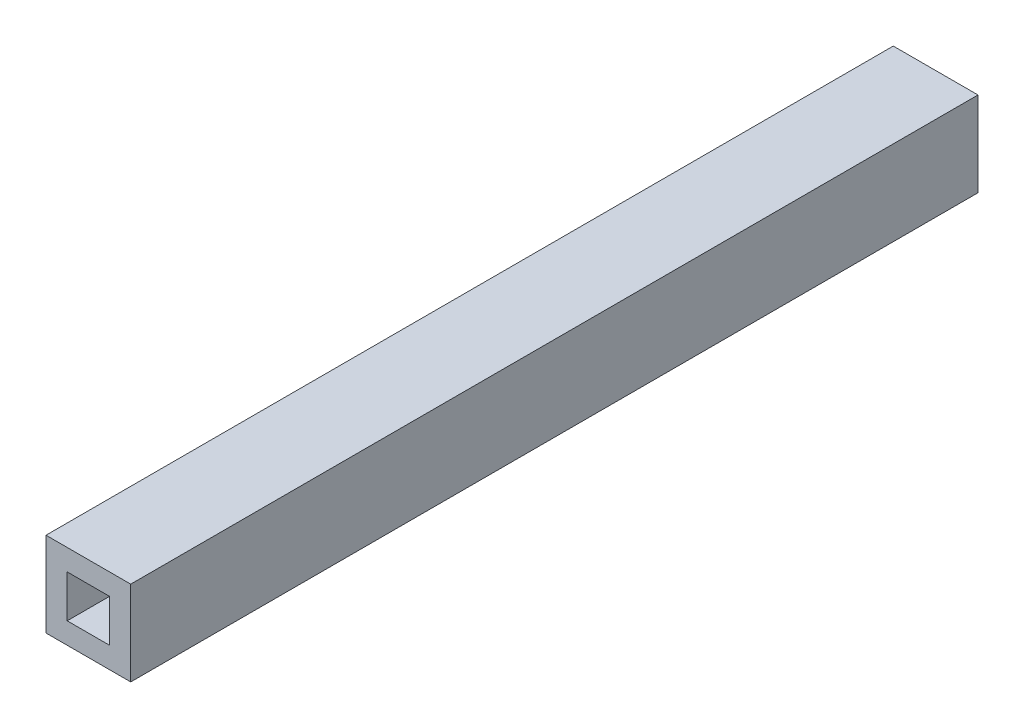
ISO-10303-21;
HEADER;
FILE_DESCRIPTION(('STEP AP214'),'2;1');
FILE_NAME('part.step','',(''),(''),'','','');
FILE_SCHEMA(('AUTOMOTIVE_DESIGN { 1 0 10303 214 1 1 1 1 }'));
ENDSEC;
DATA;
#1=APPLICATION_CONTEXT('core data for automotive mechanical design processes');
#2=APPLICATION_PROTOCOL_DEFINITION('international standard','automotive_design',2000,#1);
#3=PRODUCT_CONTEXT('',#1,'mechanical');
#4=PRODUCT('Part','Part','',(#3));
#5=PRODUCT_RELATED_PRODUCT_CATEGORY('part','',(#4));
#6=PRODUCT_DEFINITION_FORMATION('','',#4);
#7=PRODUCT_DEFINITION_CONTEXT('part definition',#1,'design');
#8=PRODUCT_DEFINITION('design','',#6,#7);
#9=PRODUCT_DEFINITION_SHAPE('','',#8);
#10=(LENGTH_UNIT() NAMED_UNIT(*) SI_UNIT(.MILLI.,.METRE.));
#11=(NAMED_UNIT(*) PLANE_ANGLE_UNIT() SI_UNIT($,.RADIAN.));
#12=(NAMED_UNIT(*) SI_UNIT($,.STERADIAN.) SOLID_ANGLE_UNIT());
#13=UNCERTAINTY_MEASURE_WITH_UNIT(LENGTH_MEASURE(1.E-05),#10,'distance_accuracy_value','');
#14=(GEOMETRIC_REPRESENTATION_CONTEXT(3) GLOBAL_UNCERTAINTY_ASSIGNED_CONTEXT((#13)) GLOBAL_UNIT_ASSIGNED_CONTEXT((#10,
#11,#12)) REPRESENTATION_CONTEXT('',''));
#15=CARTESIAN_POINT('',(0.,0.,0.));
#16=DIRECTION('',(0.,0.,1.));
#17=DIRECTION('',(1.,0.,0.));
#18=AXIS2_PLACEMENT_3D('',#15,#16,#17);
#19=CARTESIAN_POINT('',(0.,0.,200.));
#20=DIRECTION('',(0.,0.,1.));
#21=DIRECTION('',(1.,0.,0.));
#22=AXIS2_PLACEMENT_3D('',#19,#20,#21);
#23=PLANE('',#22);
#24=DIRECTION('',(0.,1.,0.));
#25=VECTOR('',#24,1.);
#26=CARTESIAN_POINT('',(10.,-10.,200.));
#27=LINE('',#26,#25);
#28=CARTESIAN_POINT('',(10.,-10.,200.));
#29=VERTEX_POINT('',#28);
#30=CARTESIAN_POINT('',(10.,10.,200.));
#31=VERTEX_POINT('',#30);
#32=EDGE_CURVE('E158',#29,#31,#27,.T.);
#33=ORIENTED_EDGE('',*,*,#32,.T.);
#34=DIRECTION('',(-1.,0.,0.));
#35=VECTOR('',#34,1.);
#36=CARTESIAN_POINT('',(-10.,10.,200.));
#37=LINE('',#36,#35);
#38=CARTESIAN_POINT('',(-10.,10.,200.));
#39=VERTEX_POINT('',#38);
#40=EDGE_CURVE('E161',#31,#39,#37,.T.);
#41=ORIENTED_EDGE('',*,*,#40,.T.);
#42=DIRECTION('',(0.,-1.,0.));
#43=VECTOR('',#42,1.);
#44=CARTESIAN_POINT('',(-10.,-10.,200.));
#45=LINE('',#44,#43);
#46=CARTESIAN_POINT('',(-10.,-10.,200.));
#47=VERTEX_POINT('',#46);
#48=EDGE_CURVE('E164',#39,#47,#45,.T.);
#49=ORIENTED_EDGE('',*,*,#48,.T.);
#50=DIRECTION('',(1.,0.,0.));
#51=VECTOR('',#50,1.);
#52=CARTESIAN_POINT('',(-10.,-10.,200.));
#53=LINE('',#52,#51);
#54=EDGE_CURVE('E166',#47,#29,#53,.T.);
#55=ORIENTED_EDGE('',*,*,#54,.T.);
#56=EDGE_LOOP('',(#33,#41,#49,#55));
#57=FACE_BOUND('',#56,.T.);
#58=DIRECTION('',(-1.,0.,0.));
#59=VECTOR('',#58,1.);
#60=CARTESIAN_POINT('',(0.,5.,200.));
#61=LINE('',#60,#59);
#62=CARTESIAN_POINT('',(5.,5.,200.));
#63=VERTEX_POINT('',#62);
#64=CARTESIAN_POINT('',(-5.,5.,200.));
#65=VERTEX_POINT('',#64);
#66=EDGE_CURVE('E130',#63,#65,#61,.T.);
#67=ORIENTED_EDGE('',*,*,#66,.F.);
#68=DIRECTION('',(0.,1.,0.));
#69=VECTOR('',#68,1.);
#70=CARTESIAN_POINT('',(5.,0.,200.));
#71=LINE('',#70,#69);
#72=CARTESIAN_POINT('',(5.,-5.,200.));
#73=VERTEX_POINT('',#72);
#74=EDGE_CURVE('E122',#73,#63,#71,.T.);
#75=ORIENTED_EDGE('',*,*,#74,.F.);
#76=DIRECTION('',(1.,0.,0.));
#77=VECTOR('',#76,1.);
#78=CARTESIAN_POINT('',(0.,-5.,200.));
#79=LINE('',#78,#77);
#80=CARTESIAN_POINT('',(-5.,-5.,200.));
#81=VERTEX_POINT('',#80);
#82=EDGE_CURVE('E144',#81,#73,#79,.T.);
#83=ORIENTED_EDGE('',*,*,#82,.F.);
#84=DIRECTION('',(0.,-1.,0.));
#85=VECTOR('',#84,1.);
#86=CARTESIAN_POINT('',(-5.,0.,200.));
#87=LINE('',#86,#85);
#88=EDGE_CURVE('E142',#65,#81,#87,.T.);
#89=ORIENTED_EDGE('',*,*,#88,.F.);
#90=EDGE_LOOP('',(#67,#75,#83,#89));
#91=FACE_BOUND('',#90,.T.);
#92=ADVANCED_FACE('F57',(#57,#91),#23,.T.);
#93=CARTESIAN_POINT('',(0.,0.,0.));
#94=DIRECTION('',(0.,0.,1.));
#95=DIRECTION('',(1.,0.,0.));
#96=AXIS2_PLACEMENT_3D('',#93,#94,#95);
#97=PLANE('',#96);
#98=DIRECTION('',(0.,1.,0.));
#99=VECTOR('',#98,1.);
#100=CARTESIAN_POINT('',(10.,-10.,0.));
#101=LINE('',#100,#99);
#102=CARTESIAN_POINT('',(10.,-10.,0.));
#103=VERTEX_POINT('',#102);
#104=CARTESIAN_POINT('',(10.,10.,0.));
#105=VERTEX_POINT('',#104);
#106=EDGE_CURVE('E138',#103,#105,#101,.T.);
#107=ORIENTED_EDGE('',*,*,#106,.F.);
#108=DIRECTION('',(1.,0.,0.));
#109=VECTOR('',#108,1.);
#110=CARTESIAN_POINT('',(-10.,-10.,0.));
#111=LINE('',#110,#109);
#112=CARTESIAN_POINT('',(-10.,-10.,0.));
#113=VERTEX_POINT('',#112);
#114=EDGE_CURVE('E162',#113,#103,#111,.T.);
#115=ORIENTED_EDGE('',*,*,#114,.F.);
#116=DIRECTION('',(0.,-1.,0.));
#117=VECTOR('',#116,1.);
#118=CARTESIAN_POINT('',(-10.,-10.,0.));
#119=LINE('',#118,#117);
#120=CARTESIAN_POINT('',(-10.,10.,0.));
#121=VERTEX_POINT('',#120);
#122=EDGE_CURVE('E173',#121,#113,#119,.T.);
#123=ORIENTED_EDGE('',*,*,#122,.F.);
#124=DIRECTION('',(-1.,0.,0.));
#125=VECTOR('',#124,1.);
#126=CARTESIAN_POINT('',(-10.,10.,0.));
#127=LINE('',#126,#125);
#128=EDGE_CURVE('E171',#105,#121,#127,.T.);
#129=ORIENTED_EDGE('',*,*,#128,.F.);
#130=EDGE_LOOP('',(#107,#115,#123,#129));
#131=FACE_BOUND('',#130,.T.);
#132=DIRECTION('',(0.,1.,0.));
#133=VECTOR('',#132,1.);
#134=CARTESIAN_POINT('',(5.,0.,0.));
#135=LINE('',#134,#133);
#136=CARTESIAN_POINT('',(5.,-5.,0.));
#137=VERTEX_POINT('',#136);
#138=CARTESIAN_POINT('',(5.,5.,0.));
#139=VERTEX_POINT('',#138);
#140=EDGE_CURVE('E80',#137,#139,#135,.T.);
#141=ORIENTED_EDGE('',*,*,#140,.T.);
#142=DIRECTION('',(-1.,0.,0.));
#143=VECTOR('',#142,1.);
#144=CARTESIAN_POINT('',(0.,5.,0.));
#145=LINE('',#144,#143);
#146=CARTESIAN_POINT('',(-5.,5.,0.));
#147=VERTEX_POINT('',#146);
#148=EDGE_CURVE('E137',#139,#147,#145,.T.);
#149=ORIENTED_EDGE('',*,*,#148,.T.);
#150=DIRECTION('',(0.,-1.,0.));
#151=VECTOR('',#150,1.);
#152=CARTESIAN_POINT('',(-5.,0.,0.));
#153=LINE('',#152,#151);
#154=CARTESIAN_POINT('',(-5.,-5.,0.));
#155=VERTEX_POINT('',#154);
#156=EDGE_CURVE('E150',#147,#155,#153,.T.);
#157=ORIENTED_EDGE('',*,*,#156,.T.);
#158=DIRECTION('',(1.,0.,0.));
#159=VECTOR('',#158,1.);
#160=CARTESIAN_POINT('',(0.,-5.,0.));
#161=LINE('',#160,#159);
#162=EDGE_CURVE('E131',#155,#137,#161,.T.);
#163=ORIENTED_EDGE('',*,*,#162,.T.);
#164=EDGE_LOOP('',(#141,#149,#157,#163));
#165=FACE_BOUND('',#164,.T.);
#166=ADVANCED_FACE('F191',(#131,#165),#97,.F.);
#167=CARTESIAN_POINT('',(10.,-10.,200.));
#168=DIRECTION('',(-1.,0.,0.));
#169=DIRECTION('',(0.,0.,1.));
#170=AXIS2_PLACEMENT_3D('',#167,#168,#169);
#171=PLANE('',#170);
#172=ORIENTED_EDGE('',*,*,#106,.T.);
#173=DIRECTION('',(0.,0.,-1.));
#174=VECTOR('',#173,1.);
#175=CARTESIAN_POINT('',(10.,10.,200.));
#176=LINE('',#175,#174);
#177=EDGE_CURVE('E12',#31,#105,#176,.T.);
#178=ORIENTED_EDGE('',*,*,#177,.F.);
#179=ORIENTED_EDGE('',*,*,#32,.F.);
#180=DIRECTION('',(0.,0.,-1.));
#181=VECTOR('',#180,1.);
#182=CARTESIAN_POINT('',(10.,-10.,200.));
#183=LINE('',#182,#181);
#184=EDGE_CURVE('E168',#29,#103,#183,.T.);
#185=ORIENTED_EDGE('',*,*,#184,.T.);
#186=EDGE_LOOP('',(#172,#178,#179,#185));
#187=FACE_BOUND('',#186,.T.);
#188=ADVANCED_FACE('F59',(#187),#171,.F.);
#189=CARTESIAN_POINT('',(-10.,10.,200.));
#190=DIRECTION('',(0.,-1.,0.));
#191=DIRECTION('',(0.,0.,-1.));
#192=AXIS2_PLACEMENT_3D('',#189,#190,#191);
#193=PLANE('',#192);
#194=ORIENTED_EDGE('',*,*,#128,.T.);
#195=DIRECTION('',(0.,0.,-1.));
#196=VECTOR('',#195,1.);
#197=CARTESIAN_POINT('',(-10.,10.,200.));
#198=LINE('',#197,#196);
#199=EDGE_CURVE('E65',#39,#121,#198,.T.);
#200=ORIENTED_EDGE('',*,*,#199,.F.);
#201=ORIENTED_EDGE('',*,*,#40,.F.);
#202=ORIENTED_EDGE('',*,*,#177,.T.);
#203=EDGE_LOOP('',(#194,#200,#201,#202));
#204=FACE_BOUND('',#203,.T.);
#205=ADVANCED_FACE('F201',(#204),#193,.F.);
#206=CARTESIAN_POINT('',(-10.,-10.,200.));
#207=DIRECTION('',(1.,0.,0.));
#208=DIRECTION('',(0.,0.,-1.));
#209=AXIS2_PLACEMENT_3D('',#206,#207,#208);
#210=PLANE('',#209);
#211=ORIENTED_EDGE('',*,*,#122,.T.);
#212=DIRECTION('',(0.,0.,-1.));
#213=VECTOR('',#212,1.);
#214=CARTESIAN_POINT('',(-10.,-10.,200.));
#215=LINE('',#214,#213);
#216=EDGE_CURVE('E178',#47,#113,#215,.T.);
#217=ORIENTED_EDGE('',*,*,#216,.F.);
#218=ORIENTED_EDGE('',*,*,#48,.F.);
#219=ORIENTED_EDGE('',*,*,#199,.T.);
#220=EDGE_LOOP('',(#211,#217,#218,#219));
#221=FACE_BOUND('',#220,.T.);
#222=ADVANCED_FACE('F185',(#221),#210,.F.);
#223=CARTESIAN_POINT('',(-10.,-10.,200.));
#224=DIRECTION('',(0.,1.,0.));
#225=DIRECTION('',(0.,0.,1.));
#226=AXIS2_PLACEMENT_3D('',#223,#224,#225);
#227=PLANE('',#226);
#228=ORIENTED_EDGE('',*,*,#114,.T.);
#229=ORIENTED_EDGE('',*,*,#184,.F.);
#230=ORIENTED_EDGE('',*,*,#54,.F.);
#231=ORIENTED_EDGE('',*,*,#216,.T.);
#232=EDGE_LOOP('',(#228,#229,#230,#231));
#233=FACE_BOUND('',#232,.T.);
#234=ADVANCED_FACE('F195',(#233),#227,.F.);
#235=CARTESIAN_POINT('',(5.,0.,200.));
#236=DIRECTION('',(-1.,0.,0.));
#237=DIRECTION('',(0.,0.,1.));
#238=AXIS2_PLACEMENT_3D('',#235,#236,#237);
#239=PLANE('',#238);
#240=ORIENTED_EDGE('',*,*,#140,.F.);
#241=DIRECTION('',(0.,0.,-1.));
#242=VECTOR('',#241,1.);
#243=CARTESIAN_POINT('',(5.,-5.,200.));
#244=LINE('',#243,#242);
#245=EDGE_CURVE('E126',#73,#137,#244,.T.);
#246=ORIENTED_EDGE('',*,*,#245,.F.);
#247=ORIENTED_EDGE('',*,*,#74,.T.);
#248=DIRECTION('',(0.,0.,-1.));
#249=VECTOR('',#248,1.);
#250=CARTESIAN_POINT('',(5.,5.,200.));
#251=LINE('',#250,#249);
#252=EDGE_CURVE('E125',#63,#139,#251,.T.);
#253=ORIENTED_EDGE('',*,*,#252,.T.);
#254=EDGE_LOOP('',(#240,#246,#247,#253));
#255=FACE_BOUND('',#254,.T.);
#256=ADVANCED_FACE('F124',(#255),#239,.T.);
#257=CARTESIAN_POINT('',(0.,5.,200.));
#258=DIRECTION('',(0.,-1.,0.));
#259=DIRECTION('',(0.,0.,-1.));
#260=AXIS2_PLACEMENT_3D('',#257,#258,#259);
#261=PLANE('',#260);
#262=ORIENTED_EDGE('',*,*,#148,.F.);
#263=ORIENTED_EDGE('',*,*,#252,.F.);
#264=ORIENTED_EDGE('',*,*,#66,.T.);
#265=DIRECTION('',(0.,0.,-1.));
#266=VECTOR('',#265,1.);
#267=CARTESIAN_POINT('',(-5.,5.,200.));
#268=LINE('',#267,#266);
#269=EDGE_CURVE('E139',#65,#147,#268,.T.);
#270=ORIENTED_EDGE('',*,*,#269,.T.);
#271=EDGE_LOOP('',(#262,#263,#264,#270));
#272=FACE_BOUND('',#271,.T.);
#273=ADVANCED_FACE('F134',(#272),#261,.T.);
#274=CARTESIAN_POINT('',(-5.,0.,200.));
#275=DIRECTION('',(1.,0.,0.));
#276=DIRECTION('',(0.,0.,-1.));
#277=AXIS2_PLACEMENT_3D('',#274,#275,#276);
#278=PLANE('',#277);
#279=ORIENTED_EDGE('',*,*,#156,.F.);
#280=ORIENTED_EDGE('',*,*,#269,.F.);
#281=ORIENTED_EDGE('',*,*,#88,.T.);
#282=DIRECTION('',(0.,0.,-1.));
#283=VECTOR('',#282,1.);
#284=CARTESIAN_POINT('',(-5.,-5.,200.));
#285=LINE('',#284,#283);
#286=EDGE_CURVE('E72',#81,#155,#285,.T.);
#287=ORIENTED_EDGE('',*,*,#286,.T.);
#288=EDGE_LOOP('',(#279,#280,#281,#287));
#289=FACE_BOUND('',#288,.T.);
#290=ADVANCED_FACE('F224',(#289),#278,.T.);
#291=CARTESIAN_POINT('',(0.,-5.,200.));
#292=DIRECTION('',(0.,1.,0.));
#293=DIRECTION('',(0.,0.,1.));
#294=AXIS2_PLACEMENT_3D('',#291,#292,#293);
#295=PLANE('',#294);
#296=ORIENTED_EDGE('',*,*,#162,.F.);
#297=ORIENTED_EDGE('',*,*,#286,.F.);
#298=ORIENTED_EDGE('',*,*,#82,.T.);
#299=ORIENTED_EDGE('',*,*,#245,.T.);
#300=EDGE_LOOP('',(#296,#297,#298,#299));
#301=FACE_BOUND('',#300,.T.);
#302=ADVANCED_FACE('F228',(#301),#295,.T.);
#303=CLOSED_SHELL('',(#92,#166,#188,#205,#222,#234,#256,#273,#290,#302));
#304=MANIFOLD_SOLID_BREP('B2',#303);
#305=ADVANCED_BREP_SHAPE_REPRESENTATION('',(#18,#304),#14);
#306=SHAPE_DEFINITION_REPRESENTATION(#9,#305);
ENDSEC;
END-ISO-10303-21;
